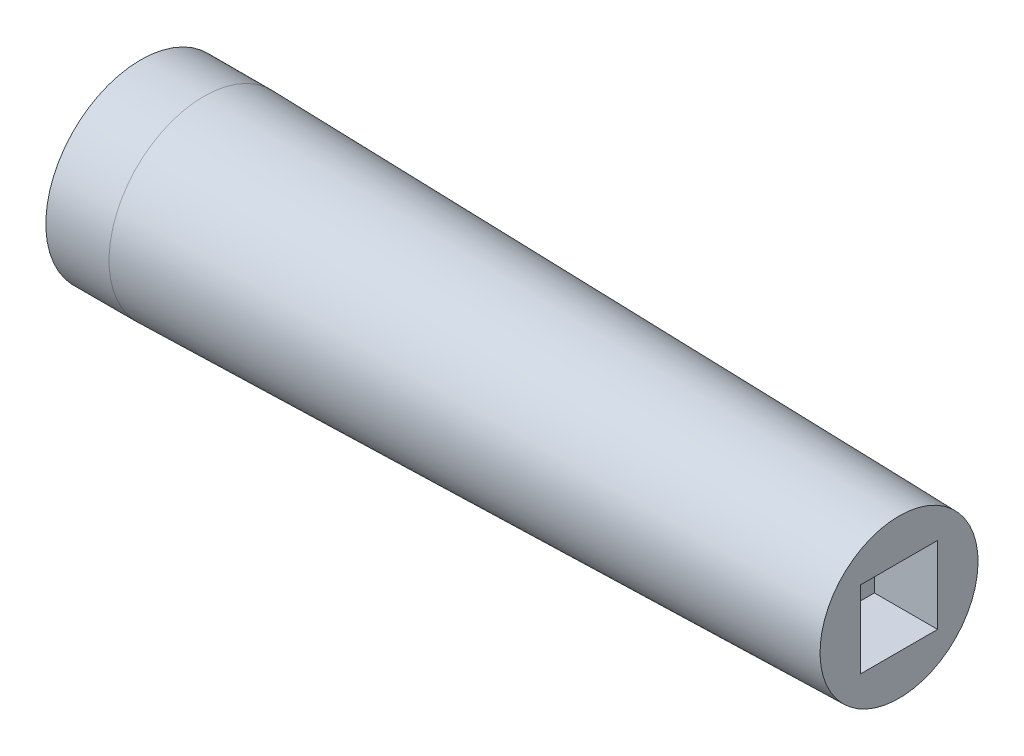
ISO-10303-21;
HEADER;
FILE_DESCRIPTION(('STEP AP214'),'2;1');
FILE_NAME('part.step','',(''),(''),'','','');
FILE_SCHEMA(('AUTOMOTIVE_DESIGN { 1 0 10303 214 1 1 1 1 }'));
ENDSEC;
DATA;
#1=APPLICATION_CONTEXT('core data for automotive mechanical design processes');
#2=APPLICATION_PROTOCOL_DEFINITION('international standard','automotive_design',2000,#1);
#3=PRODUCT_CONTEXT('',#1,'mechanical');
#4=PRODUCT('Part','Part','',(#3));
#5=PRODUCT_RELATED_PRODUCT_CATEGORY('part','',(#4));
#6=PRODUCT_DEFINITION_FORMATION('','',#4);
#7=PRODUCT_DEFINITION_CONTEXT('part definition',#1,'design');
#8=PRODUCT_DEFINITION('design','',#6,#7);
#9=PRODUCT_DEFINITION_SHAPE('','',#8);
#10=(LENGTH_UNIT() NAMED_UNIT(*) SI_UNIT(.MILLI.,.METRE.));
#11=(NAMED_UNIT(*) PLANE_ANGLE_UNIT() SI_UNIT($,.RADIAN.));
#12=(NAMED_UNIT(*) SI_UNIT($,.STERADIAN.) SOLID_ANGLE_UNIT());
#13=UNCERTAINTY_MEASURE_WITH_UNIT(LENGTH_MEASURE(1.E-05),#10,'distance_accuracy_value','');
#14=(GEOMETRIC_REPRESENTATION_CONTEXT(3) GLOBAL_UNCERTAINTY_ASSIGNED_CONTEXT((#13)) GLOBAL_UNIT_ASSIGNED_CONTEXT((#10,
#11,#12)) REPRESENTATION_CONTEXT('',''));
#15=CARTESIAN_POINT('',(0.,0.,0.));
#16=DIRECTION('',(0.,0.,1.));
#17=DIRECTION('',(1.,0.,0.));
#18=AXIS2_PLACEMENT_3D('',#15,#16,#17);
#19=CARTESIAN_POINT('',(0.,0.,0.));
#20=DIRECTION('',(-1.,0.,0.));
#21=DIRECTION('',(0.,-1.,0.));
#22=AXIS2_PLACEMENT_3D('',#19,#20,#21);
#23=CONICAL_SURFACE('',#22,15.875,0.0227233608416411);
#24=CARTESIAN_POINT('',(-139.7,0.,0.));
#25=DIRECTION('',(1.,0.,0.));
#26=DIRECTION('',(0.,1.,0.));
#27=AXIS2_PLACEMENT_3D('',#24,#25,#26);
#28=CIRCLE('',#27,19.05);
#29=CARTESIAN_POINT('',(-139.7,19.05,0.));
#30=VERTEX_POINT('',#29);
#31=EDGE_CURVE('E110',#30,#30,#28,.T.);
#32=ORIENTED_EDGE('',*,*,#31,.T.);
#33=EDGE_LOOP('',(#32));
#34=FACE_BOUND('',#33,.T.);
#35=CARTESIAN_POINT('',(0.,0.,0.));
#36=DIRECTION('',(1.,0.,0.));
#37=DIRECTION('',(0.,1.,0.));
#38=AXIS2_PLACEMENT_3D('',#35,#36,#37);
#39=CIRCLE('',#38,15.875);
#40=CARTESIAN_POINT('',(0.,15.875,0.));
#41=VERTEX_POINT('',#40);
#42=EDGE_CURVE('E11',#41,#41,#39,.T.);
#43=ORIENTED_EDGE('',*,*,#42,.F.);
#44=EDGE_LOOP('',(#43));
#45=FACE_BOUND('',#44,.T.);
#46=ADVANCED_FACE('F35',(#34,#45),#23,.T.);
#47=CARTESIAN_POINT('',(0.,15.875,0.));
#48=DIRECTION('',(1.,0.,0.));
#49=DIRECTION('',(0.,1.,0.));
#50=AXIS2_PLACEMENT_3D('',#47,#48,#49);
#51=PLANE('',#50);
#52=DIRECTION('',(0.,1.,0.));
#53=VECTOR('',#52,1.);
#54=CARTESIAN_POINT('',(0.,-7.747,-7.747));
#55=LINE('',#54,#53);
#56=CARTESIAN_POINT('',(0.,-7.747,-7.747));
#57=VERTEX_POINT('',#56);
#58=CARTESIAN_POINT('',(0.,7.747,-7.747));
#59=VERTEX_POINT('',#58);
#60=EDGE_CURVE('E49',#57,#59,#55,.T.);
#61=ORIENTED_EDGE('',*,*,#60,.F.);
#62=DIRECTION('',(0.,0.,-1.));
#63=VECTOR('',#62,1.);
#64=CARTESIAN_POINT('',(0.,-7.747,7.747));
#65=LINE('',#64,#63);
#66=CARTESIAN_POINT('',(0.,-7.747,7.747));
#67=VERTEX_POINT('',#66);
#68=EDGE_CURVE('E100',#67,#57,#65,.T.);
#69=ORIENTED_EDGE('',*,*,#68,.F.);
#70=DIRECTION('',(0.,-1.,0.));
#71=VECTOR('',#70,1.);
#72=CARTESIAN_POINT('',(0.,-7.747,7.747));
#73=LINE('',#72,#71);
#74=CARTESIAN_POINT('',(0.,7.747,7.747));
#75=VERTEX_POINT('',#74);
#76=EDGE_CURVE('E106',#75,#67,#73,.T.);
#77=ORIENTED_EDGE('',*,*,#76,.F.);
#78=DIRECTION('',(0.,0.,1.));
#79=VECTOR('',#78,1.);
#80=CARTESIAN_POINT('',(0.,7.747,7.747));
#81=LINE('',#80,#79);
#82=EDGE_CURVE('E84',#59,#75,#81,.T.);
#83=ORIENTED_EDGE('',*,*,#82,.F.);
#84=EDGE_LOOP('',(#61,#69,#77,#83));
#85=FACE_BOUND('',#84,.T.);
#86=ORIENTED_EDGE('',*,*,#42,.T.);
#87=EDGE_LOOP('',(#86));
#88=FACE_BOUND('',#87,.T.);
#89=ADVANCED_FACE('F122',(#85,#88),#51,.T.);
#90=CARTESIAN_POINT('',(-152.4,0.,0.));
#91=DIRECTION('',(-1.,0.,0.));
#92=DIRECTION('',(0.,-1.,0.));
#93=AXIS2_PLACEMENT_3D('',#90,#91,#92);
#94=PLANE('',#93);
#95=CARTESIAN_POINT('',(-152.4,0.,0.));
#96=DIRECTION('',(1.,0.,0.));
#97=DIRECTION('',(0.,1.,0.));
#98=AXIS2_PLACEMENT_3D('',#95,#96,#97);
#99=CIRCLE('',#98,19.05);
#100=CARTESIAN_POINT('',(-152.4,19.05,0.));
#101=VERTEX_POINT('',#100);
#102=EDGE_CURVE('E42',#101,#101,#99,.T.);
#103=ORIENTED_EDGE('',*,*,#102,.F.);
#104=EDGE_LOOP('',(#103));
#105=FACE_BOUND('',#104,.T.);
#106=ADVANCED_FACE('F120',(#105),#94,.T.);
#107=CARTESIAN_POINT('',(0.,0.,0.));
#108=DIRECTION('',(1.,0.,0.));
#109=DIRECTION('',(0.,1.,0.));
#110=AXIS2_PLACEMENT_3D('',#107,#108,#109);
#111=CYLINDRICAL_SURFACE('',#110,19.05);
#112=ORIENTED_EDGE('',*,*,#102,.T.);
#113=EDGE_LOOP('',(#112));
#114=FACE_BOUND('',#113,.T.);
#115=ORIENTED_EDGE('',*,*,#31,.F.);
#116=EDGE_LOOP('',(#115));
#117=FACE_BOUND('',#116,.T.);
#118=ADVANCED_FACE('F117',(#114,#117),#111,.T.);
#119=CARTESIAN_POINT('',(-12.7,-7.747,-7.747));
#120=DIRECTION('',(0.,0.,-1.));
#121=DIRECTION('',(-1.,0.,0.));
#122=AXIS2_PLACEMENT_3D('',#119,#120,#121);
#123=PLANE('',#122);
#124=ORIENTED_EDGE('',*,*,#60,.T.);
#125=DIRECTION('',(1.,0.,0.));
#126=VECTOR('',#125,1.);
#127=CARTESIAN_POINT('',(-12.7,7.747,-7.747));
#128=LINE('',#127,#126);
#129=CARTESIAN_POINT('',(-12.7,7.747,-7.747));
#130=VERTEX_POINT('',#129);
#131=EDGE_CURVE('E72',#130,#59,#128,.T.);
#132=ORIENTED_EDGE('',*,*,#131,.F.);
#133=DIRECTION('',(0.,1.,0.));
#134=VECTOR('',#133,1.);
#135=CARTESIAN_POINT('',(-12.7,-7.747,-7.747));
#136=LINE('',#135,#134);
#137=CARTESIAN_POINT('',(-12.7,-7.747,-7.747));
#138=VERTEX_POINT('',#137);
#139=EDGE_CURVE('E98',#138,#130,#136,.T.);
#140=ORIENTED_EDGE('',*,*,#139,.F.);
#141=DIRECTION('',(1.,0.,0.));
#142=VECTOR('',#141,1.);
#143=CARTESIAN_POINT('',(-12.7,-7.747,-7.747));
#144=LINE('',#143,#142);
#145=EDGE_CURVE('E57',#138,#57,#144,.T.);
#146=ORIENTED_EDGE('',*,*,#145,.T.);
#147=EDGE_LOOP('',(#124,#132,#140,#146));
#148=FACE_BOUND('',#147,.T.);
#149=ADVANCED_FACE('F128',(#148),#123,.F.);
#150=CARTESIAN_POINT('',(-12.7,-7.747,7.747));
#151=DIRECTION('',(0.,-1.,0.));
#152=DIRECTION('',(1.,0.,0.));
#153=AXIS2_PLACEMENT_3D('',#150,#151,#152);
#154=PLANE('',#153);
#155=ORIENTED_EDGE('',*,*,#68,.T.);
#156=ORIENTED_EDGE('',*,*,#145,.F.);
#157=DIRECTION('',(0.,0.,-1.));
#158=VECTOR('',#157,1.);
#159=CARTESIAN_POINT('',(-12.7,-7.747,7.747));
#160=LINE('',#159,#158);
#161=CARTESIAN_POINT('',(-12.7,-7.747,7.747));
#162=VERTEX_POINT('',#161);
#163=EDGE_CURVE('E95',#162,#138,#160,.T.);
#164=ORIENTED_EDGE('',*,*,#163,.F.);
#165=DIRECTION('',(1.,0.,0.));
#166=VECTOR('',#165,1.);
#167=CARTESIAN_POINT('',(-12.7,-7.747,7.747));
#168=LINE('',#167,#166);
#169=EDGE_CURVE('E88',#162,#67,#168,.T.);
#170=ORIENTED_EDGE('',*,*,#169,.T.);
#171=EDGE_LOOP('',(#155,#156,#164,#170));
#172=FACE_BOUND('',#171,.T.);
#173=ADVANCED_FACE('F156',(#172),#154,.F.);
#174=CARTESIAN_POINT('',(-12.7,-7.747,7.747));
#175=DIRECTION('',(0.,0.,1.));
#176=DIRECTION('',(1.,0.,0.));
#177=AXIS2_PLACEMENT_3D('',#174,#175,#176);
#178=PLANE('',#177);
#179=ORIENTED_EDGE('',*,*,#76,.T.);
#180=ORIENTED_EDGE('',*,*,#169,.F.);
#181=DIRECTION('',(0.,-1.,0.));
#182=VECTOR('',#181,1.);
#183=CARTESIAN_POINT('',(-12.7,-7.747,7.747));
#184=LINE('',#183,#182);
#185=CARTESIAN_POINT('',(-12.7,7.747,7.747));
#186=VERTEX_POINT('',#185);
#187=EDGE_CURVE('E91',#186,#162,#184,.T.);
#188=ORIENTED_EDGE('',*,*,#187,.F.);
#189=DIRECTION('',(1.,0.,0.));
#190=VECTOR('',#189,1.);
#191=CARTESIAN_POINT('',(-12.7,7.747,7.747));
#192=LINE('',#191,#190);
#193=EDGE_CURVE('E77',#186,#75,#192,.T.);
#194=ORIENTED_EDGE('',*,*,#193,.T.);
#195=EDGE_LOOP('',(#179,#180,#188,#194));
#196=FACE_BOUND('',#195,.T.);
#197=ADVANCED_FACE('F92',(#196),#178,.F.);
#198=CARTESIAN_POINT('',(-12.7,7.747,7.747));
#199=DIRECTION('',(0.,1.,0.));
#200=DIRECTION('',(-1.,0.,0.));
#201=AXIS2_PLACEMENT_3D('',#198,#199,#200);
#202=PLANE('',#201);
#203=ORIENTED_EDGE('',*,*,#82,.T.);
#204=ORIENTED_EDGE('',*,*,#193,.F.);
#205=DIRECTION('',(0.,0.,1.));
#206=VECTOR('',#205,1.);
#207=CARTESIAN_POINT('',(-12.7,7.747,7.747));
#208=LINE('',#207,#206);
#209=EDGE_CURVE('E81',#130,#186,#208,.T.);
#210=ORIENTED_EDGE('',*,*,#209,.F.);
#211=ORIENTED_EDGE('',*,*,#131,.T.);
#212=EDGE_LOOP('',(#203,#204,#210,#211));
#213=FACE_BOUND('',#212,.T.);
#214=ADVANCED_FACE('F79',(#213),#202,.F.);
#215=CARTESIAN_POINT('',(-12.7,0.,0.));
#216=DIRECTION('',(-1.,0.,0.));
#217=DIRECTION('',(0.,-1.,0.));
#218=AXIS2_PLACEMENT_3D('',#215,#216,#217);
#219=PLANE('',#218);
#220=ORIENTED_EDGE('',*,*,#139,.T.);
#221=ORIENTED_EDGE('',*,*,#209,.T.);
#222=ORIENTED_EDGE('',*,*,#187,.T.);
#223=ORIENTED_EDGE('',*,*,#163,.T.);
#224=EDGE_LOOP('',(#220,#221,#222,#223));
#225=FACE_BOUND('',#224,.T.);
#226=ADVANCED_FACE('F97',(#225),#219,.F.);
#227=CLOSED_SHELL('',(#46,#89,#106,#118,#149,#173,#197,#214,#226));
#228=MANIFOLD_SOLID_BREP('B2',#227);
#229=ADVANCED_BREP_SHAPE_REPRESENTATION('',(#18,#228),#14);
#230=SHAPE_DEFINITION_REPRESENTATION(#9,#229);
ENDSEC;
END-ISO-10303-21;
